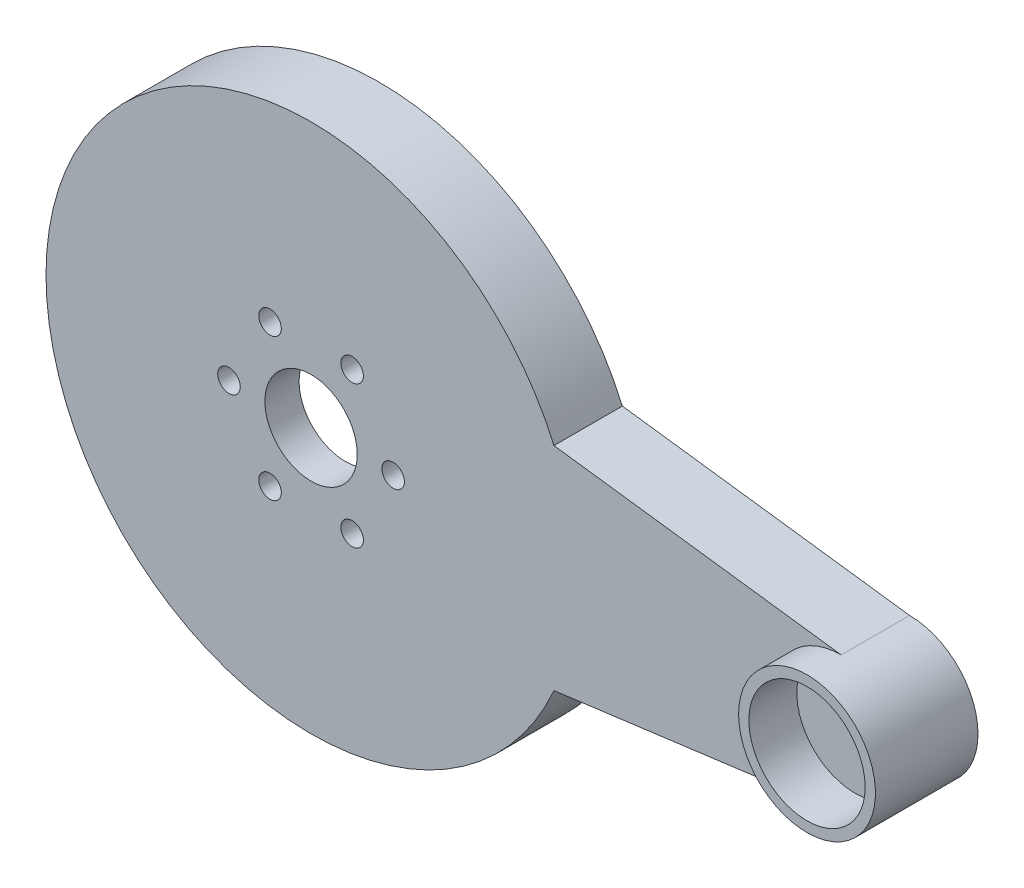
ISO-10303-21;
HEADER;
FILE_DESCRIPTION(('STEP AP214'),'2;1');
FILE_NAME('part.step','',(''),(''),'','','');
FILE_SCHEMA(('AUTOMOTIVE_DESIGN { 1 0 10303 214 1 1 1 1 }'));
ENDSEC;
DATA;
#1=APPLICATION_CONTEXT('core data for automotive mechanical design processes');
#2=APPLICATION_PROTOCOL_DEFINITION('international standard','automotive_design',2000,#1);
#3=PRODUCT_CONTEXT('',#1,'mechanical');
#4=PRODUCT('Part','Part','',(#3));
#5=PRODUCT_RELATED_PRODUCT_CATEGORY('part','',(#4));
#6=PRODUCT_DEFINITION_FORMATION('','',#4);
#7=PRODUCT_DEFINITION_CONTEXT('part definition',#1,'design');
#8=PRODUCT_DEFINITION('design','',#6,#7);
#9=PRODUCT_DEFINITION_SHAPE('','',#8);
#10=(LENGTH_UNIT() NAMED_UNIT(*) SI_UNIT(.MILLI.,.METRE.));
#11=(NAMED_UNIT(*) PLANE_ANGLE_UNIT() SI_UNIT($,.RADIAN.));
#12=(NAMED_UNIT(*) SI_UNIT($,.STERADIAN.) SOLID_ANGLE_UNIT());
#13=UNCERTAINTY_MEASURE_WITH_UNIT(LENGTH_MEASURE(1.E-05),#10,'distance_accuracy_value','');
#14=(GEOMETRIC_REPRESENTATION_CONTEXT(3) GLOBAL_UNCERTAINTY_ASSIGNED_CONTEXT((#13)) GLOBAL_UNIT_ASSIGNED_CONTEXT((#10,
#11,#12)) REPRESENTATION_CONTEXT('',''));
#15=CARTESIAN_POINT('',(0.,0.,0.));
#16=DIRECTION('',(0.,0.,1.));
#17=DIRECTION('',(1.,0.,0.));
#18=AXIS2_PLACEMENT_3D('',#15,#16,#17);
#19=CARTESIAN_POINT('',(0.,0.,0.));
#20=DIRECTION('',(0.,0.,1.));
#21=DIRECTION('',(1.,0.,0.));
#22=AXIS2_PLACEMENT_3D('',#19,#20,#21);
#23=CYLINDRICAL_SURFACE('',#22,6.75);
#24=CARTESIAN_POINT('',(0.,0.,10.));
#25=DIRECTION('',(0.,0.,1.));
#26=DIRECTION('',(1.,0.,0.));
#27=AXIS2_PLACEMENT_3D('',#24,#25,#26);
#28=CIRCLE('',#27,6.75);
#29=CARTESIAN_POINT('',(6.75,0.,10.));
#30=VERTEX_POINT('',#29);
#31=EDGE_CURVE('E150',#30,#30,#28,.T.);
#32=ORIENTED_EDGE('',*,*,#31,.T.);
#33=EDGE_LOOP('',(#32));
#34=FACE_BOUND('',#33,.T.);
#35=CARTESIAN_POINT('',(0.,0.,5.));
#36=DIRECTION('',(0.,0.,-1.));
#37=DIRECTION('',(-1.,0.,0.));
#38=AXIS2_PLACEMENT_3D('',#35,#36,#37);
#39=CIRCLE('',#38,6.75);
#40=CARTESIAN_POINT('',(-6.75,0.,5.));
#41=VERTEX_POINT('',#40);
#42=EDGE_CURVE('E141',#41,#41,#39,.F.);
#43=ORIENTED_EDGE('',*,*,#42,.F.);
#44=EDGE_LOOP('',(#43));
#45=FACE_BOUND('',#44,.T.);
#46=ADVANCED_FACE('F41',(#34,#45),#23,.F.);
#47=CARTESIAN_POINT('',(12.,0.,0.));
#48=DIRECTION('',(0.,0.,1.));
#49=DIRECTION('',(1.,0.,0.));
#50=AXIS2_PLACEMENT_3D('',#47,#48,#49);
#51=CYLINDRICAL_SURFACE('',#50,1.65);
#52=CARTESIAN_POINT('',(12.,0.,10.));
#53=DIRECTION('',(0.,0.,1.));
#54=DIRECTION('',(1.,0.,0.));
#55=AXIS2_PLACEMENT_3D('',#52,#53,#54);
#56=CIRCLE('',#55,1.65);
#57=CARTESIAN_POINT('',(13.65,0.,10.));
#58=VERTEX_POINT('',#57);
#59=EDGE_CURVE('E146',#58,#58,#56,.T.);
#60=ORIENTED_EDGE('',*,*,#59,.T.);
#61=EDGE_LOOP('',(#60));
#62=FACE_BOUND('',#61,.T.);
#63=CARTESIAN_POINT('',(12.,0.,5.));
#64=DIRECTION('',(0.,0.,-1.));
#65=DIRECTION('',(-1.,0.,0.));
#66=AXIS2_PLACEMENT_3D('',#63,#64,#65);
#67=CIRCLE('',#66,1.65);
#68=CARTESIAN_POINT('',(10.35,0.,5.));
#69=VERTEX_POINT('',#68);
#70=EDGE_CURVE('E137',#69,#69,#67,.F.);
#71=ORIENTED_EDGE('',*,*,#70,.F.);
#72=EDGE_LOOP('',(#71));
#73=FACE_BOUND('',#72,.T.);
#74=ADVANCED_FACE('F209',(#62,#73),#51,.F.);
#75=CARTESIAN_POINT('',(5.99999999999998,-10.3923048454133,0.));
#76=DIRECTION('',(0.,0.,1.));
#77=DIRECTION('',(1.,0.,0.));
#78=AXIS2_PLACEMENT_3D('',#75,#76,#77);
#79=CYLINDRICAL_SURFACE('',#78,1.65);
#80=CARTESIAN_POINT('',(5.99999999999998,-10.3923048454133,10.));
#81=DIRECTION('',(0.,0.,1.));
#82=DIRECTION('',(1.,0.,0.));
#83=AXIS2_PLACEMENT_3D('',#80,#81,#82);
#84=CIRCLE('',#83,1.65);
#85=CARTESIAN_POINT('',(7.64999999999998,-10.3923048454133,10.));
#86=VERTEX_POINT('',#85);
#87=EDGE_CURVE('E151',#86,#86,#84,.T.);
#88=ORIENTED_EDGE('',*,*,#87,.T.);
#89=EDGE_LOOP('',(#88));
#90=FACE_BOUND('',#89,.T.);
#91=CARTESIAN_POINT('',(5.99999999999998,-10.3923048454133,5.));
#92=DIRECTION('',(0.,0.,-1.));
#93=DIRECTION('',(-1.,0.,0.));
#94=AXIS2_PLACEMENT_3D('',#91,#92,#93);
#95=CIRCLE('',#94,1.65);
#96=CARTESIAN_POINT('',(4.34999999999997,-10.3923048454133,5.));
#97=VERTEX_POINT('',#96);
#98=EDGE_CURVE('E133',#97,#97,#95,.F.);
#99=ORIENTED_EDGE('',*,*,#98,.F.);
#100=EDGE_LOOP('',(#99));
#101=FACE_BOUND('',#100,.T.);
#102=ADVANCED_FACE('F215',(#90,#101),#79,.F.);
#103=CARTESIAN_POINT('',(-6.00000000000005,-10.3923048454132,0.));
#104=DIRECTION('',(0.,0.,1.));
#105=DIRECTION('',(1.,0.,0.));
#106=AXIS2_PLACEMENT_3D('',#103,#104,#105);
#107=CYLINDRICAL_SURFACE('',#106,1.65);
#108=CARTESIAN_POINT('',(-6.00000000000005,-10.3923048454132,10.));
#109=DIRECTION('',(0.,0.,1.));
#110=DIRECTION('',(1.,0.,0.));
#111=AXIS2_PLACEMENT_3D('',#108,#109,#110);
#112=CIRCLE('',#111,1.65);
#113=CARTESIAN_POINT('',(-4.35000000000005,-10.3923048454132,10.));
#114=VERTEX_POINT('',#113);
#115=EDGE_CURVE('E155',#114,#114,#112,.T.);
#116=ORIENTED_EDGE('',*,*,#115,.T.);
#117=EDGE_LOOP('',(#116));
#118=FACE_BOUND('',#117,.T.);
#119=CARTESIAN_POINT('',(-6.00000000000005,-10.3923048454132,5.));
#120=DIRECTION('',(0.,0.,-1.));
#121=DIRECTION('',(-1.,0.,0.));
#122=AXIS2_PLACEMENT_3D('',#119,#120,#121);
#123=CIRCLE('',#122,1.65);
#124=CARTESIAN_POINT('',(-7.65000000000005,-10.3923048454132,5.));
#125=VERTEX_POINT('',#124);
#126=EDGE_CURVE('E129',#125,#125,#123,.F.);
#127=ORIENTED_EDGE('',*,*,#126,.F.);
#128=EDGE_LOOP('',(#127));
#129=FACE_BOUND('',#128,.T.);
#130=ADVANCED_FACE('F256',(#118,#129),#107,.F.);
#131=CARTESIAN_POINT('',(-12.,0.,0.));
#132=DIRECTION('',(0.,0.,1.));
#133=DIRECTION('',(1.,0.,0.));
#134=AXIS2_PLACEMENT_3D('',#131,#132,#133);
#135=CYLINDRICAL_SURFACE('',#134,1.65);
#136=CARTESIAN_POINT('',(-12.,0.,10.));
#137=DIRECTION('',(0.,0.,1.));
#138=DIRECTION('',(1.,0.,0.));
#139=AXIS2_PLACEMENT_3D('',#136,#137,#138);
#140=CIRCLE('',#139,1.65);
#141=CARTESIAN_POINT('',(-10.35,0.,10.));
#142=VERTEX_POINT('',#141);
#143=EDGE_CURVE('E159',#142,#142,#140,.T.);
#144=ORIENTED_EDGE('',*,*,#143,.T.);
#145=EDGE_LOOP('',(#144));
#146=FACE_BOUND('',#145,.T.);
#147=CARTESIAN_POINT('',(-12.,0.,5.));
#148=DIRECTION('',(0.,0.,-1.));
#149=DIRECTION('',(-1.,0.,0.));
#150=AXIS2_PLACEMENT_3D('',#147,#148,#149);
#151=CIRCLE('',#150,1.65);
#152=CARTESIAN_POINT('',(-13.65,0.,5.));
#153=VERTEX_POINT('',#152);
#154=EDGE_CURVE('E125',#153,#153,#151,.F.);
#155=ORIENTED_EDGE('',*,*,#154,.F.);
#156=EDGE_LOOP('',(#155));
#157=FACE_BOUND('',#156,.T.);
#158=ADVANCED_FACE('F262',(#146,#157),#135,.F.);
#159=CARTESIAN_POINT('',(-5.9999999999999,10.3923048454133,0.));
#160=DIRECTION('',(0.,0.,1.));
#161=DIRECTION('',(1.,0.,0.));
#162=AXIS2_PLACEMENT_3D('',#159,#160,#161);
#163=CYLINDRICAL_SURFACE('',#162,1.65);
#164=CARTESIAN_POINT('',(-5.9999999999999,10.3923048454133,10.));
#165=DIRECTION('',(0.,0.,1.));
#166=DIRECTION('',(1.,0.,0.));
#167=AXIS2_PLACEMENT_3D('',#164,#165,#166);
#168=CIRCLE('',#167,1.65);
#169=CARTESIAN_POINT('',(-4.3499999999999,10.3923048454133,10.));
#170=VERTEX_POINT('',#169);
#171=EDGE_CURVE('E163',#170,#170,#168,.T.);
#172=ORIENTED_EDGE('',*,*,#171,.T.);
#173=EDGE_LOOP('',(#172));
#174=FACE_BOUND('',#173,.T.);
#175=CARTESIAN_POINT('',(-5.9999999999999,10.3923048454133,5.));
#176=DIRECTION('',(0.,0.,-1.));
#177=DIRECTION('',(-1.,0.,0.));
#178=AXIS2_PLACEMENT_3D('',#175,#176,#177);
#179=CIRCLE('',#178,1.65);
#180=CARTESIAN_POINT('',(-7.64999999999991,10.3923048454133,5.));
#181=VERTEX_POINT('',#180);
#182=EDGE_CURVE('E121',#181,#181,#179,.F.);
#183=ORIENTED_EDGE('',*,*,#182,.F.);
#184=EDGE_LOOP('',(#183));
#185=FACE_BOUND('',#184,.T.);
#186=ADVANCED_FACE('F267',(#174,#185),#163,.F.);
#187=CARTESIAN_POINT('',(6.00000000000012,10.3923048454132,0.));
#188=DIRECTION('',(0.,0.,1.));
#189=DIRECTION('',(1.,0.,0.));
#190=AXIS2_PLACEMENT_3D('',#187,#188,#189);
#191=CYLINDRICAL_SURFACE('',#190,1.65);
#192=CARTESIAN_POINT('',(6.00000000000012,10.3923048454132,10.));
#193=DIRECTION('',(0.,0.,1.));
#194=DIRECTION('',(1.,0.,0.));
#195=AXIS2_PLACEMENT_3D('',#192,#193,#194);
#196=CIRCLE('',#195,1.65);
#197=CARTESIAN_POINT('',(7.65000000000012,10.3923048454132,10.));
#198=VERTEX_POINT('',#197);
#199=EDGE_CURVE('E145',#198,#198,#196,.T.);
#200=ORIENTED_EDGE('',*,*,#199,.T.);
#201=EDGE_LOOP('',(#200));
#202=FACE_BOUND('',#201,.T.);
#203=CARTESIAN_POINT('',(6.00000000000012,10.3923048454132,5.));
#204=DIRECTION('',(0.,0.,-1.));
#205=DIRECTION('',(-1.,0.,0.));
#206=AXIS2_PLACEMENT_3D('',#203,#204,#205);
#207=CIRCLE('',#206,1.65);
#208=CARTESIAN_POINT('',(4.35000000000012,10.3923048454132,5.));
#209=VERTEX_POINT('',#208);
#210=EDGE_CURVE('E45',#209,#209,#207,.F.);
#211=ORIENTED_EDGE('',*,*,#210,.F.);
#212=EDGE_LOOP('',(#211));
#213=FACE_BOUND('',#212,.T.);
#214=ADVANCED_FACE('F220',(#202,#213),#191,.F.);
#215=CARTESIAN_POINT('',(77.5,0.,10.));
#216=DIRECTION('',(0.,0.,-1.));
#217=DIRECTION('',(-1.,0.,0.));
#218=AXIS2_PLACEMENT_3D('',#215,#216,#217);
#219=CYLINDRICAL_SURFACE('',#218,9.99999999999999);
#220=CARTESIAN_POINT('',(77.5,0.,0.));
#221=DIRECTION('',(0.,0.,1.));
#222=DIRECTION('',(1.,0.,0.));
#223=AXIS2_PLACEMENT_3D('',#220,#221,#222);
#224=CIRCLE('',#223,9.99999999999999);
#225=CARTESIAN_POINT('',(77.5,-9.99999999999999,0.));
#226=VERTEX_POINT('',#225);
#227=CARTESIAN_POINT('',(77.5,9.99999999999999,0.));
#228=VERTEX_POINT('',#227);
#229=EDGE_CURVE('E92',#226,#228,#224,.T.);
#230=ORIENTED_EDGE('',*,*,#229,.T.);
#231=DIRECTION('',(0.,0.,-1.));
#232=VECTOR('',#231,1.);
#233=CARTESIAN_POINT('',(77.5,9.99999999999999,10.));
#234=LINE('',#233,#232);
#235=CARTESIAN_POINT('',(77.5,9.99999999999999,10.));
#236=VERTEX_POINT('',#235);
#237=EDGE_CURVE('E11',#236,#228,#234,.T.);
#238=ORIENTED_EDGE('',*,*,#237,.F.);
#239=CARTESIAN_POINT('',(77.5,0.,10.));
#240=DIRECTION('',(0.,0.,1.));
#241=DIRECTION('',(1.,0.,0.));
#242=AXIS2_PLACEMENT_3D('',#239,#240,#241);
#243=CIRCLE('',#242,9.99999999999999);
#244=CARTESIAN_POINT('',(77.5,-9.99999999999999,10.));
#245=VERTEX_POINT('',#244);
#246=EDGE_CURVE('E91',#236,#245,#243,.T.);
#247=ORIENTED_EDGE('',*,*,#246,.T.);
#248=DIRECTION('',(0.,0.,-1.));
#249=VECTOR('',#248,1.);
#250=CARTESIAN_POINT('',(77.5,-9.99999999999999,10.));
#251=LINE('',#250,#249);
#252=EDGE_CURVE('E60',#245,#226,#251,.T.);
#253=ORIENTED_EDGE('',*,*,#252,.T.);
#254=EDGE_LOOP('',(#230,#238,#247,#253));
#255=FACE_BOUND('',#254,.T.);
#256=CARTESIAN_POINT('',(77.5,0.,15.));
#257=DIRECTION('',(0.,0.,-1.));
#258=DIRECTION('',(-1.,0.,0.));
#259=AXIS2_PLACEMENT_3D('',#256,#257,#258);
#260=CIRCLE('',#259,9.99999999999999);
#261=CARTESIAN_POINT('',(67.5,0.,15.));
#262=VERTEX_POINT('',#261);
#263=EDGE_CURVE('E106',#262,#262,#260,.T.);
#264=ORIENTED_EDGE('',*,*,#263,.T.);
#265=EDGE_LOOP('',(#264));
#266=FACE_BOUND('',#265,.T.);
#267=ADVANCED_FACE('F43',(#255,#266),#219,.T.);
#268=CARTESIAN_POINT('',(2.60258834313398,19.8299403407116,10.));
#269=DIRECTION('',(-0.130129417156699,-0.991497017035582,0.));
#270=DIRECTION('',(0.991497017035582,-0.130129417156699,0.));
#271=AXIS2_PLACEMENT_3D('',#268,#269,#270);
#272=PLANE('',#271);
#273=DIRECTION('',(-0.991497017035582,0.130129417156699,0.));
#274=VECTOR('',#273,1.);
#275=CARTESIAN_POINT('',(2.60258834313398,19.8299403407116,0.));
#276=LINE('',#275,#274);
#277=CARTESIAN_POINT('',(35.5101711990293,15.5109716464067,0.));
#278=VERTEX_POINT('',#277);
#279=EDGE_CURVE('E179',#228,#278,#276,.T.);
#280=ORIENTED_EDGE('',*,*,#279,.T.);
#281=DIRECTION('',(0.,0.,-1.));
#282=VECTOR('',#281,1.);
#283=CARTESIAN_POINT('',(35.5101711990293,15.5109716464067,10.));
#284=LINE('',#283,#282);
#285=CARTESIAN_POINT('',(35.5101711990293,15.5109716464067,10.));
#286=VERTEX_POINT('',#285);
#287=EDGE_CURVE('E52',#286,#278,#284,.T.);
#288=ORIENTED_EDGE('',*,*,#287,.F.);
#289=DIRECTION('',(-0.991497017035582,0.130129417156699,0.));
#290=VECTOR('',#289,1.);
#291=CARTESIAN_POINT('',(2.60258834313398,19.8299403407116,10.));
#292=LINE('',#291,#290);
#293=EDGE_CURVE('E86',#236,#286,#292,.T.);
#294=ORIENTED_EDGE('',*,*,#293,.F.);
#295=ORIENTED_EDGE('',*,*,#237,.T.);
#296=EDGE_LOOP('',(#280,#288,#294,#295));
#297=FACE_BOUND('',#296,.T.);
#298=ADVANCED_FACE('F94',(#297),#272,.F.);
#299=CARTESIAN_POINT('',(0.,0.,10.));
#300=DIRECTION('',(0.,0.,-1.));
#301=DIRECTION('',(-1.,0.,0.));
#302=AXIS2_PLACEMENT_3D('',#299,#300,#301);
#303=CYLINDRICAL_SURFACE('',#302,38.75);
#304=CARTESIAN_POINT('',(0.,0.,0.));
#305=DIRECTION('',(0.,0.,1.));
#306=DIRECTION('',(1.,0.,0.));
#307=AXIS2_PLACEMENT_3D('',#304,#305,#306);
#308=CIRCLE('',#307,38.75);
#309=CARTESIAN_POINT('',(35.5101711990293,-15.5109716464067,0.));
#310=VERTEX_POINT('',#309);
#311=EDGE_CURVE('E182',#278,#310,#308,.T.);
#312=ORIENTED_EDGE('',*,*,#311,.T.);
#313=DIRECTION('',(0.,0.,-1.));
#314=VECTOR('',#313,1.);
#315=CARTESIAN_POINT('',(35.5101711990293,-15.5109716464067,10.));
#316=LINE('',#315,#314);
#317=CARTESIAN_POINT('',(35.5101711990293,-15.5109716464067,10.));
#318=VERTEX_POINT('',#317);
#319=EDGE_CURVE('E76',#318,#310,#316,.T.);
#320=ORIENTED_EDGE('',*,*,#319,.F.);
#321=CARTESIAN_POINT('',(0.,0.,10.));
#322=DIRECTION('',(0.,0.,1.));
#323=DIRECTION('',(1.,0.,0.));
#324=AXIS2_PLACEMENT_3D('',#321,#322,#323);
#325=CIRCLE('',#324,38.75);
#326=EDGE_CURVE('E98',#286,#318,#325,.T.);
#327=ORIENTED_EDGE('',*,*,#326,.F.);
#328=ORIENTED_EDGE('',*,*,#287,.T.);
#329=EDGE_LOOP('',(#312,#320,#327,#328));
#330=FACE_BOUND('',#329,.T.);
#331=ADVANCED_FACE('F195',(#330),#303,.T.);
#332=CARTESIAN_POINT('',(2.60258834313398,-19.8299403407116,10.));
#333=DIRECTION('',(0.130129417156699,-0.991497017035582,0.));
#334=DIRECTION('',(0.991497017035582,0.130129417156699,0.));
#335=AXIS2_PLACEMENT_3D('',#332,#333,#334);
#336=PLANE('',#335);
#337=DIRECTION('',(-0.991497017035582,-0.130129417156699,0.));
#338=VECTOR('',#337,1.);
#339=CARTESIAN_POINT('',(2.60258834313398,-19.8299403407116,0.));
#340=LINE('',#339,#338);
#341=EDGE_CURVE('E99',#226,#310,#340,.T.);
#342=ORIENTED_EDGE('',*,*,#341,.F.);
#343=ORIENTED_EDGE('',*,*,#252,.F.);
#344=DIRECTION('',(-0.991497017035582,-0.130129417156699,0.));
#345=VECTOR('',#344,1.);
#346=CARTESIAN_POINT('',(2.60258834313398,-19.8299403407116,10.));
#347=LINE('',#346,#345);
#348=EDGE_CURVE('E103',#245,#318,#347,.T.);
#349=ORIENTED_EDGE('',*,*,#348,.T.);
#350=ORIENTED_EDGE('',*,*,#319,.T.);
#351=EDGE_LOOP('',(#342,#343,#349,#350));
#352=FACE_BOUND('',#351,.T.);
#353=ADVANCED_FACE('F198',(#352),#336,.T.);
#354=CARTESIAN_POINT('',(0.,0.,10.));
#355=DIRECTION('',(0.,0.,1.));
#356=DIRECTION('',(1.,0.,0.));
#357=AXIS2_PLACEMENT_3D('',#354,#355,#356);
#358=PLANE('',#357);
#359=ORIENTED_EDGE('',*,*,#246,.F.);
#360=ORIENTED_EDGE('',*,*,#293,.T.);
#361=ORIENTED_EDGE('',*,*,#326,.T.);
#362=ORIENTED_EDGE('',*,*,#348,.F.);
#363=EDGE_LOOP('',(#359,#360,#361,#362));
#364=FACE_BOUND('',#363,.T.);
#365=ORIENTED_EDGE('',*,*,#199,.F.);
#366=EDGE_LOOP('',(#365));
#367=FACE_BOUND('',#366,.T.);
#368=ORIENTED_EDGE('',*,*,#171,.F.);
#369=EDGE_LOOP('',(#368));
#370=FACE_BOUND('',#369,.T.);
#371=ORIENTED_EDGE('',*,*,#143,.F.);
#372=EDGE_LOOP('',(#371));
#373=FACE_BOUND('',#372,.T.);
#374=ORIENTED_EDGE('',*,*,#115,.F.);
#375=EDGE_LOOP('',(#374));
#376=FACE_BOUND('',#375,.T.);
#377=ORIENTED_EDGE('',*,*,#87,.F.);
#378=EDGE_LOOP('',(#377));
#379=FACE_BOUND('',#378,.T.);
#380=ORIENTED_EDGE('',*,*,#59,.F.);
#381=EDGE_LOOP('',(#380));
#382=FACE_BOUND('',#381,.T.);
#383=ORIENTED_EDGE('',*,*,#31,.F.);
#384=EDGE_LOOP('',(#383));
#385=FACE_BOUND('',#384,.T.);
#386=ADVANCED_FACE('F101',(#364,#367,#370,#373,#376,#379,#382,#385),#358,.T.);
#387=CARTESIAN_POINT('',(0.,0.,0.));
#388=DIRECTION('',(0.,0.,1.));
#389=DIRECTION('',(1.,0.,0.));
#390=AXIS2_PLACEMENT_3D('',#387,#388,#389);
#391=PLANE('',#390);
#392=CARTESIAN_POINT('',(0.,0.,0.));
#393=DIRECTION('',(0.,0.,-1.));
#394=DIRECTION('',(-1.,0.,0.));
#395=AXIS2_PLACEMENT_3D('',#392,#393,#394);
#396=CIRCLE('',#395,20.);
#397=CARTESIAN_POINT('',(-20.,0.,0.));
#398=VERTEX_POINT('',#397);
#399=EDGE_CURVE('E105',#398,#398,#396,.T.);
#400=ORIENTED_EDGE('',*,*,#399,.F.);
#401=EDGE_LOOP('',(#400));
#402=FACE_BOUND('',#401,.T.);
#403=ORIENTED_EDGE('',*,*,#279,.F.);
#404=ORIENTED_EDGE('',*,*,#229,.F.);
#405=ORIENTED_EDGE('',*,*,#341,.T.);
#406=ORIENTED_EDGE('',*,*,#311,.F.);
#407=EDGE_LOOP('',(#403,#404,#405,#406));
#408=FACE_BOUND('',#407,.T.);
#409=ADVANCED_FACE('F197',(#402,#408),#391,.F.);
#410=CARTESIAN_POINT('',(0.,0.,5.));
#411=DIRECTION('',(0.,0.,-1.));
#412=DIRECTION('',(-1.,0.,0.));
#413=AXIS2_PLACEMENT_3D('',#410,#411,#412);
#414=PLANE('',#413);
#415=CARTESIAN_POINT('',(0.,0.,5.));
#416=DIRECTION('',(0.,0.,-1.));
#417=DIRECTION('',(-1.,0.,0.));
#418=AXIS2_PLACEMENT_3D('',#415,#416,#417);
#419=CIRCLE('',#418,15.);
#420=CARTESIAN_POINT('',(-15.,0.,5.));
#421=VERTEX_POINT('',#420);
#422=EDGE_CURVE('E111',#421,#421,#419,.T.);
#423=ORIENTED_EDGE('',*,*,#422,.T.);
#424=EDGE_LOOP('',(#423));
#425=FACE_BOUND('',#424,.T.);
#426=ORIENTED_EDGE('',*,*,#210,.T.);
#427=EDGE_LOOP('',(#426));
#428=FACE_BOUND('',#427,.T.);
#429=ORIENTED_EDGE('',*,*,#182,.T.);
#430=EDGE_LOOP('',(#429));
#431=FACE_BOUND('',#430,.T.);
#432=ORIENTED_EDGE('',*,*,#154,.T.);
#433=EDGE_LOOP('',(#432));
#434=FACE_BOUND('',#433,.T.);
#435=ORIENTED_EDGE('',*,*,#126,.T.);
#436=EDGE_LOOP('',(#435));
#437=FACE_BOUND('',#436,.T.);
#438=ORIENTED_EDGE('',*,*,#98,.T.);
#439=EDGE_LOOP('',(#438));
#440=FACE_BOUND('',#439,.T.);
#441=ORIENTED_EDGE('',*,*,#70,.T.);
#442=EDGE_LOOP('',(#441));
#443=FACE_BOUND('',#442,.T.);
#444=ORIENTED_EDGE('',*,*,#42,.T.);
#445=EDGE_LOOP('',(#444));
#446=FACE_BOUND('',#445,.T.);
#447=ADVANCED_FACE('F223',(#425,#428,#431,#434,#437,#440,#443,#446),#414,.T.);
#448=CARTESIAN_POINT('',(0.,0.,5.));
#449=DIRECTION('',(0.,0.,-1.));
#450=DIRECTION('',(-1.,0.,0.));
#451=AXIS2_PLACEMENT_3D('',#448,#449,#450);
#452=CONICAL_SURFACE('',#451,15.,0.785398163397447);
#453=ORIENTED_EDGE('',*,*,#399,.T.);
#454=EDGE_LOOP('',(#453));
#455=FACE_BOUND('',#454,.T.);
#456=ORIENTED_EDGE('',*,*,#422,.F.);
#457=EDGE_LOOP('',(#456));
#458=FACE_BOUND('',#457,.T.);
#459=ADVANCED_FACE('F228',(#455,#458),#452,.F.);
#460=CARTESIAN_POINT('',(77.5,0.,15.));
#461=DIRECTION('',(0.,0.,-1.));
#462=DIRECTION('',(-1.,0.,0.));
#463=AXIS2_PLACEMENT_3D('',#460,#461,#462);
#464=PLANE('',#463);
#465=CARTESIAN_POINT('',(77.5,0.,15.));
#466=DIRECTION('',(0.,0.,1.));
#467=DIRECTION('',(1.,0.,0.));
#468=AXIS2_PLACEMENT_3D('',#465,#466,#467);
#469=CIRCLE('',#468,8.5);
#470=CARTESIAN_POINT('',(86.,0.,15.));
#471=VERTEX_POINT('',#470);
#472=EDGE_CURVE('E410',#471,#471,#469,.T.);
#473=ORIENTED_EDGE('',*,*,#472,.F.);
#474=EDGE_LOOP('',(#473));
#475=FACE_BOUND('',#474,.T.);
#476=ORIENTED_EDGE('',*,*,#263,.F.);
#477=EDGE_LOOP('',(#476));
#478=FACE_BOUND('',#477,.T.);
#479=ADVANCED_FACE('F235',(#475,#478),#464,.F.);
#480=CARTESIAN_POINT('',(77.5,0.,8.));
#481=DIRECTION('',(0.,0.,1.));
#482=DIRECTION('',(1.,0.,0.));
#483=AXIS2_PLACEMENT_3D('',#480,#481,#482);
#484=CYLINDRICAL_SURFACE('',#483,8.5);
#485=CARTESIAN_POINT('',(77.5,0.,8.));
#486=DIRECTION('',(0.,0.,1.));
#487=DIRECTION('',(1.,0.,0.));
#488=AXIS2_PLACEMENT_3D('',#485,#486,#487);
#489=CIRCLE('',#488,8.5);
#490=CARTESIAN_POINT('',(86.,0.,8.));
#491=VERTEX_POINT('',#490);
#492=EDGE_CURVE('E114',#491,#491,#489,.T.);
#493=ORIENTED_EDGE('',*,*,#492,.F.);
#494=EDGE_LOOP('',(#493));
#495=FACE_BOUND('',#494,.T.);
#496=ORIENTED_EDGE('',*,*,#472,.T.);
#497=EDGE_LOOP('',(#496));
#498=FACE_BOUND('',#497,.T.);
#499=ADVANCED_FACE('F383',(#495,#498),#484,.F.);
#500=CARTESIAN_POINT('',(77.5,0.,8.));
#501=DIRECTION('',(0.,0.,1.));
#502=DIRECTION('',(1.,0.,0.));
#503=AXIS2_PLACEMENT_3D('',#500,#501,#502);
#504=PLANE('',#503);
#505=ORIENTED_EDGE('',*,*,#492,.T.);
#506=EDGE_LOOP('',(#505));
#507=FACE_BOUND('',#506,.T.);
#508=ADVANCED_FACE('F393',(#507),#504,.T.);
#509=CLOSED_SHELL('',(#46,#74,#102,#130,#158,#186,#214,#267,#298,#331,#353,#386,#409,#447,#459,
#479,#499,#508));
#510=MANIFOLD_SOLID_BREP('B2',#509);
#511=ADVANCED_BREP_SHAPE_REPRESENTATION('',(#18,#510),#14);
#512=SHAPE_DEFINITION_REPRESENTATION(#9,#511);
ENDSEC;
END-ISO-10303-21;
